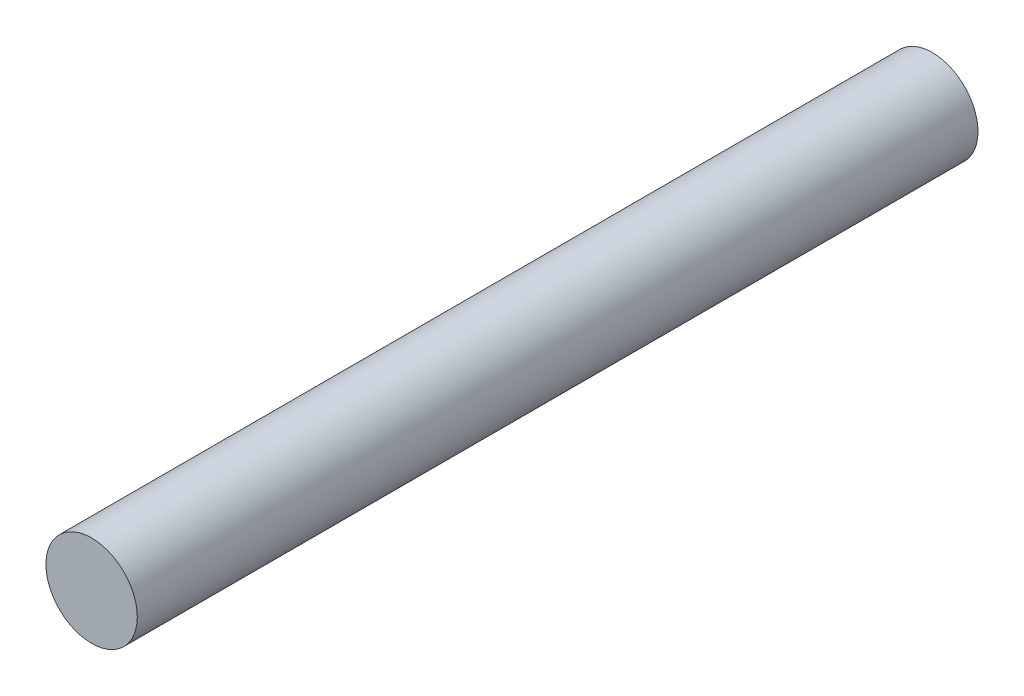
ISO-10303-21;
HEADER;
FILE_DESCRIPTION(('STEP AP214'),'2;1');
FILE_NAME('part.step','',(''),(''),'','','');
FILE_SCHEMA(('AUTOMOTIVE_DESIGN { 1 0 10303 214 1 1 1 1 }'));
ENDSEC;
DATA;
#1=APPLICATION_CONTEXT('core data for automotive mechanical design processes');
#2=APPLICATION_PROTOCOL_DEFINITION('international standard','automotive_design',2000,#1);
#3=PRODUCT_CONTEXT('',#1,'mechanical');
#4=PRODUCT('Part','Part','',(#3));
#5=PRODUCT_RELATED_PRODUCT_CATEGORY('part','',(#4));
#6=PRODUCT_DEFINITION_FORMATION('','',#4);
#7=PRODUCT_DEFINITION_CONTEXT('part definition',#1,'design');
#8=PRODUCT_DEFINITION('design','',#6,#7);
#9=PRODUCT_DEFINITION_SHAPE('','',#8);
#10=(LENGTH_UNIT() NAMED_UNIT(*) SI_UNIT(.MILLI.,.METRE.));
#11=(NAMED_UNIT(*) PLANE_ANGLE_UNIT() SI_UNIT($,.RADIAN.));
#12=(NAMED_UNIT(*) SI_UNIT($,.STERADIAN.) SOLID_ANGLE_UNIT());
#13=UNCERTAINTY_MEASURE_WITH_UNIT(LENGTH_MEASURE(1.E-05),#10,'distance_accuracy_value','');
#14=(GEOMETRIC_REPRESENTATION_CONTEXT(3) GLOBAL_UNCERTAINTY_ASSIGNED_CONTEXT((#13)) GLOBAL_UNIT_ASSIGNED_CONTEXT((#10,
#11,#12)) REPRESENTATION_CONTEXT('',''));
#15=CARTESIAN_POINT('',(0.,0.,0.));
#16=DIRECTION('',(0.,0.,1.));
#17=DIRECTION('',(1.,0.,0.));
#18=AXIS2_PLACEMENT_3D('',#15,#16,#17);
#19=CARTESIAN_POINT('',(0.,0.,23.));
#20=DIRECTION('',(0.,0.,-1.));
#21=DIRECTION('',(-1.,0.,0.));
#22=AXIS2_PLACEMENT_3D('',#19,#20,#21);
#23=CYLINDRICAL_SURFACE('',#22,2.5);
#24=CARTESIAN_POINT('',(0.,0.,23.));
#25=DIRECTION('',(0.,0.,1.));
#26=DIRECTION('',(1.,0.,0.));
#27=AXIS2_PLACEMENT_3D('',#24,#25,#26);
#28=CIRCLE('',#27,2.5);
#29=CARTESIAN_POINT('',(2.5,0.,23.));
#30=VERTEX_POINT('',#29);
#31=EDGE_CURVE('E10',#30,#30,#28,.T.);
#32=ORIENTED_EDGE('',*,*,#31,.F.);
#33=EDGE_LOOP('',(#32));
#34=FACE_BOUND('',#33,.T.);
#35=CARTESIAN_POINT('',(0.,0.,-23.));
#36=DIRECTION('',(0.,0.,1.));
#37=DIRECTION('',(1.,0.,0.));
#38=AXIS2_PLACEMENT_3D('',#35,#36,#37);
#39=CIRCLE('',#38,2.5);
#40=CARTESIAN_POINT('',(2.5,0.,-23.));
#41=VERTEX_POINT('',#40);
#42=EDGE_CURVE('E34',#41,#41,#39,.T.);
#43=ORIENTED_EDGE('',*,*,#42,.T.);
#44=EDGE_LOOP('',(#43));
#45=FACE_BOUND('',#44,.T.);
#46=ADVANCED_FACE('F31',(#34,#45),#23,.T.);
#47=CARTESIAN_POINT('',(0.,0.,23.));
#48=DIRECTION('',(0.,0.,1.));
#49=DIRECTION('',(1.,0.,0.));
#50=AXIS2_PLACEMENT_3D('',#47,#48,#49);
#51=PLANE('',#50);
#52=ORIENTED_EDGE('',*,*,#31,.T.);
#53=EDGE_LOOP('',(#52));
#54=FACE_BOUND('',#53,.T.);
#55=ADVANCED_FACE('F46',(#54),#51,.T.);
#56=CARTESIAN_POINT('',(0.,0.,-23.));
#57=DIRECTION('',(0.,0.,1.));
#58=DIRECTION('',(1.,0.,0.));
#59=AXIS2_PLACEMENT_3D('',#56,#57,#58);
#60=PLANE('',#59);
#61=ORIENTED_EDGE('',*,*,#42,.F.);
#62=EDGE_LOOP('',(#61));
#63=FACE_BOUND('',#62,.T.);
#64=ADVANCED_FACE('F44',(#63),#60,.F.);
#65=CLOSED_SHELL('',(#46,#55,#64));
#66=MANIFOLD_SOLID_BREP('B2',#65);
#67=ADVANCED_BREP_SHAPE_REPRESENTATION('',(#18,#66),#14);
#68=SHAPE_DEFINITION_REPRESENTATION(#9,#67);
ENDSEC;
END-ISO-10303-21;
